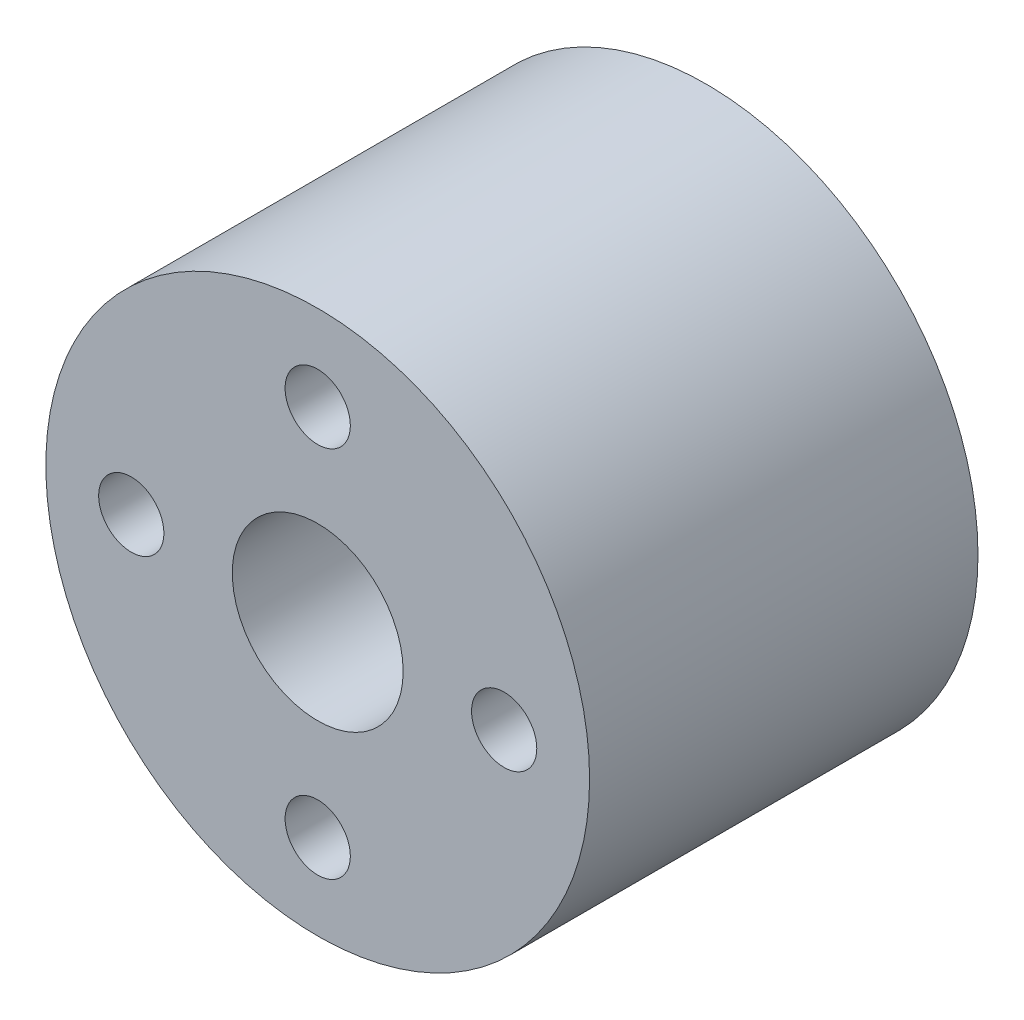
ISO-10303-21;
HEADER;
FILE_DESCRIPTION(('STEP AP214'),'2;1');
FILE_NAME('part.step','',(''),(''),'','','');
FILE_SCHEMA(('AUTOMOTIVE_DESIGN { 1 0 10303 214 1 1 1 1 }'));
ENDSEC;
DATA;
#1=APPLICATION_CONTEXT('core data for automotive mechanical design processes');
#2=APPLICATION_PROTOCOL_DEFINITION('international standard','automotive_design',2000,#1);
#3=PRODUCT_CONTEXT('',#1,'mechanical');
#4=PRODUCT('Part','Part','',(#3));
#5=PRODUCT_RELATED_PRODUCT_CATEGORY('part','',(#4));
#6=PRODUCT_DEFINITION_FORMATION('','',#4);
#7=PRODUCT_DEFINITION_CONTEXT('part definition',#1,'design');
#8=PRODUCT_DEFINITION('design','',#6,#7);
#9=PRODUCT_DEFINITION_SHAPE('','',#8);
#10=(LENGTH_UNIT() NAMED_UNIT(*) SI_UNIT(.MILLI.,.METRE.));
#11=(NAMED_UNIT(*) PLANE_ANGLE_UNIT() SI_UNIT($,.RADIAN.));
#12=(NAMED_UNIT(*) SI_UNIT($,.STERADIAN.) SOLID_ANGLE_UNIT());
#13=UNCERTAINTY_MEASURE_WITH_UNIT(LENGTH_MEASURE(1.E-05),#10,'distance_accuracy_value','');
#14=(GEOMETRIC_REPRESENTATION_CONTEXT(3) GLOBAL_UNCERTAINTY_ASSIGNED_CONTEXT((#13)) GLOBAL_UNIT_ASSIGNED_CONTEXT((#10,
#11,#12)) REPRESENTATION_CONTEXT('',''));
#15=CARTESIAN_POINT('',(0.,0.,0.));
#16=DIRECTION('',(0.,0.,1.));
#17=DIRECTION('',(1.,0.,0.));
#18=AXIS2_PLACEMENT_3D('',#15,#16,#17);
#19=CARTESIAN_POINT('',(0.,0.,-25.));
#20=DIRECTION('',(0.,0.,1.));
#21=DIRECTION('',(1.,0.,0.));
#22=AXIS2_PLACEMENT_3D('',#19,#20,#21);
#23=PLANE('',#22);
#24=CARTESIAN_POINT('',(25.0000000000002,2.45463371850718E-13,-25.));
#25=DIRECTION('',(0.,0.,1.));
#26=DIRECTION('',(1.,0.,0.));
#27=AXIS2_PLACEMENT_3D('',#24,#25,#26);
#28=CIRCLE('',#27,5.5);
#29=CARTESIAN_POINT('',(30.5000000000002,2.45463371850718E-13,-25.));
#30=VERTEX_POINT('',#29);
#31=EDGE_CURVE('E11',#30,#30,#28,.T.);
#32=ORIENTED_EDGE('',*,*,#31,.T.);
#33=EDGE_LOOP('',(#32));
#34=FACE_BOUND('',#33,.T.);
#35=CARTESIAN_POINT('',(25.0000000000002,12.,-25.));
#36=DIRECTION('',(0.,0.,1.));
#37=DIRECTION('',(1.,0.,0.));
#38=AXIS2_PLACEMENT_3D('',#35,#36,#37);
#39=CIRCLE('',#38,2.1);
#40=CARTESIAN_POINT('',(27.1000000000002,12.,-25.));
#41=VERTEX_POINT('',#40);
#42=EDGE_CURVE('E51',#41,#41,#39,.F.);
#43=ORIENTED_EDGE('',*,*,#42,.F.);
#44=EDGE_LOOP('',(#43));
#45=FACE_BOUND('',#44,.T.);
#46=CARTESIAN_POINT('',(13.0000000000005,3.71230823859037E-13,-25.));
#47=DIRECTION('',(0.,0.,1.));
#48=DIRECTION('',(1.,0.,0.));
#49=AXIS2_PLACEMENT_3D('',#46,#47,#48);
#50=CIRCLE('',#49,2.1);
#51=CARTESIAN_POINT('',(15.1000000000005,3.71230823859037E-13,-25.));
#52=VERTEX_POINT('',#51);
#53=EDGE_CURVE('E61',#52,#52,#50,.F.);
#54=ORIENTED_EDGE('',*,*,#53,.F.);
#55=EDGE_LOOP('',(#54));
#56=FACE_BOUND('',#55,.T.);
#57=CARTESIAN_POINT('',(25.0000000000002,-11.9999999999995,-25.));
#58=DIRECTION('',(0.,0.,1.));
#59=DIRECTION('',(1.,0.,0.));
#60=AXIS2_PLACEMENT_3D('',#57,#58,#59);
#61=CIRCLE('',#60,2.1);
#62=CARTESIAN_POINT('',(27.1000000000002,-11.9999999999995,-25.));
#63=VERTEX_POINT('',#62);
#64=EDGE_CURVE('E71',#63,#63,#61,.F.);
#65=ORIENTED_EDGE('',*,*,#64,.F.);
#66=EDGE_LOOP('',(#65));
#67=FACE_BOUND('',#66,.T.);
#68=CARTESIAN_POINT('',(37.,2.04697370165263E-13,-25.));
#69=DIRECTION('',(0.,0.,1.));
#70=DIRECTION('',(1.,0.,0.));
#71=AXIS2_PLACEMENT_3D('',#68,#69,#70);
#72=CIRCLE('',#71,2.1);
#73=CARTESIAN_POINT('',(39.1,2.04697370165263E-13,-25.));
#74=VERTEX_POINT('',#73);
#75=EDGE_CURVE('E60',#74,#74,#72,.F.);
#76=ORIENTED_EDGE('',*,*,#75,.F.);
#77=EDGE_LOOP('',(#76));
#78=FACE_BOUND('',#77,.T.);
#79=CARTESIAN_POINT('',(25.0000000000002,2.45463371850718E-13,-25.));
#80=DIRECTION('',(0.,0.,1.));
#81=DIRECTION('',(1.,0.,0.));
#82=AXIS2_PLACEMENT_3D('',#79,#80,#81);
#83=CIRCLE('',#82,17.5);
#84=CARTESIAN_POINT('',(42.5000000000002,2.45463371850718E-13,-25.));
#85=VERTEX_POINT('',#84);
#86=EDGE_CURVE('E70',#85,#85,#83,.T.);
#87=ORIENTED_EDGE('',*,*,#86,.F.);
#88=EDGE_LOOP('',(#87));
#89=FACE_BOUND('',#88,.T.);
#90=ADVANCED_FACE('F38',(#34,#45,#56,#67,#78,#89),#23,.F.);
#91=CARTESIAN_POINT('',(0.,0.,0.));
#92=DIRECTION('',(0.,0.,1.));
#93=DIRECTION('',(1.,0.,0.));
#94=AXIS2_PLACEMENT_3D('',#91,#92,#93);
#95=PLANE('',#94);
#96=CARTESIAN_POINT('',(25.0000000000002,2.45463371850718E-13,0.));
#97=DIRECTION('',(0.,0.,1.));
#98=DIRECTION('',(1.,0.,0.));
#99=AXIS2_PLACEMENT_3D('',#96,#97,#98);
#100=CIRCLE('',#99,5.5);
#101=CARTESIAN_POINT('',(30.5000000000002,2.45463371850718E-13,0.));
#102=VERTEX_POINT('',#101);
#103=EDGE_CURVE('E42',#102,#102,#100,.T.);
#104=ORIENTED_EDGE('',*,*,#103,.F.);
#105=EDGE_LOOP('',(#104));
#106=FACE_BOUND('',#105,.T.);
#107=CARTESIAN_POINT('',(25.0000000000002,12.,0.));
#108=DIRECTION('',(0.,0.,1.));
#109=DIRECTION('',(1.,0.,0.));
#110=AXIS2_PLACEMENT_3D('',#107,#108,#109);
#111=CIRCLE('',#110,2.1);
#112=CARTESIAN_POINT('',(27.1000000000002,12.,0.));
#113=VERTEX_POINT('',#112);
#114=EDGE_CURVE('E56',#113,#113,#111,.T.);
#115=ORIENTED_EDGE('',*,*,#114,.F.);
#116=EDGE_LOOP('',(#115));
#117=FACE_BOUND('',#116,.T.);
#118=CARTESIAN_POINT('',(13.0000000000005,3.71230823859037E-13,0.));
#119=DIRECTION('',(0.,0.,1.));
#120=DIRECTION('',(0.,1.,0.));
#121=AXIS2_PLACEMENT_3D('',#118,#119,#120);
#122=CIRCLE('',#121,2.1);
#123=CARTESIAN_POINT('',(13.0000000000005,2.10000000000037,0.));
#124=VERTEX_POINT('',#123);
#125=EDGE_CURVE('E66',#124,#124,#122,.T.);
#126=ORIENTED_EDGE('',*,*,#125,.F.);
#127=EDGE_LOOP('',(#126));
#128=FACE_BOUND('',#127,.T.);
#129=CARTESIAN_POINT('',(25.0000000000002,-11.9999999999995,0.));
#130=DIRECTION('',(0.,0.,1.));
#131=DIRECTION('',(-1.,0.,0.));
#132=AXIS2_PLACEMENT_3D('',#129,#130,#131);
#133=CIRCLE('',#132,2.1);
#134=CARTESIAN_POINT('',(22.9000000000002,-11.9999999999995,0.));
#135=VERTEX_POINT('',#134);
#136=EDGE_CURVE('E65',#135,#135,#133,.T.);
#137=ORIENTED_EDGE('',*,*,#136,.F.);
#138=EDGE_LOOP('',(#137));
#139=FACE_BOUND('',#138,.T.);
#140=CARTESIAN_POINT('',(37.,2.04697370165263E-13,0.));
#141=DIRECTION('',(0.,0.,1.));
#142=DIRECTION('',(0.,-1.,0.));
#143=AXIS2_PLACEMENT_3D('',#140,#141,#142);
#144=CIRCLE('',#143,2.1);
#145=CARTESIAN_POINT('',(37.,-2.0999999999998,0.));
#146=VERTEX_POINT('',#145);
#147=EDGE_CURVE('E75',#146,#146,#144,.T.);
#148=ORIENTED_EDGE('',*,*,#147,.F.);
#149=EDGE_LOOP('',(#148));
#150=FACE_BOUND('',#149,.T.);
#151=CARTESIAN_POINT('',(25.0000000000002,2.45463371850718E-13,0.));
#152=DIRECTION('',(0.,0.,1.));
#153=DIRECTION('',(1.,0.,0.));
#154=AXIS2_PLACEMENT_3D('',#151,#152,#153);
#155=CIRCLE('',#154,17.5);
#156=CARTESIAN_POINT('',(42.5000000000002,2.45463371850718E-13,0.));
#157=VERTEX_POINT('',#156);
#158=EDGE_CURVE('E88',#157,#157,#155,.T.);
#159=ORIENTED_EDGE('',*,*,#158,.T.);
#160=EDGE_LOOP('',(#159));
#161=FACE_BOUND('',#160,.T.);
#162=ADVANCED_FACE('F40',(#106,#117,#128,#139,#150,#161),#95,.T.);
#163=CARTESIAN_POINT('',(25.0000000000002,2.45463371850718E-13,-25.));
#164=DIRECTION('',(0.,0.,1.));
#165=DIRECTION('',(1.,0.,0.));
#166=AXIS2_PLACEMENT_3D('',#163,#164,#165);
#167=CYLINDRICAL_SURFACE('',#166,5.5);
#168=ORIENTED_EDGE('',*,*,#31,.F.);
#169=EDGE_LOOP('',(#168));
#170=FACE_BOUND('',#169,.T.);
#171=ORIENTED_EDGE('',*,*,#103,.T.);
#172=EDGE_LOOP('',(#171));
#173=FACE_BOUND('',#172,.T.);
#174=ADVANCED_FACE('F105',(#170,#173),#167,.F.);
#175=CARTESIAN_POINT('',(25.0000000000002,12.,-25.001));
#176=DIRECTION('',(0.,0.,1.));
#177=DIRECTION('',(1.,0.,0.));
#178=AXIS2_PLACEMENT_3D('',#175,#176,#177);
#179=CYLINDRICAL_SURFACE('',#178,2.1);
#180=ORIENTED_EDGE('',*,*,#114,.T.);
#181=EDGE_LOOP('',(#180));
#182=FACE_BOUND('',#181,.T.);
#183=ORIENTED_EDGE('',*,*,#42,.T.);
#184=EDGE_LOOP('',(#183));
#185=FACE_BOUND('',#184,.T.);
#186=ADVANCED_FACE('F111',(#182,#185),#179,.F.);
#187=CARTESIAN_POINT('',(13.0000000000005,3.71230823859037E-13,-25.001));
#188=DIRECTION('',(0.,0.,1.));
#189=DIRECTION('',(1.,0.,0.));
#190=AXIS2_PLACEMENT_3D('',#187,#188,#189);
#191=CYLINDRICAL_SURFACE('',#190,2.1);
#192=ORIENTED_EDGE('',*,*,#125,.T.);
#193=EDGE_LOOP('',(#192));
#194=FACE_BOUND('',#193,.T.);
#195=ORIENTED_EDGE('',*,*,#53,.T.);
#196=EDGE_LOOP('',(#195));
#197=FACE_BOUND('',#196,.T.);
#198=ADVANCED_FACE('F115',(#194,#197),#191,.F.);
#199=CARTESIAN_POINT('',(25.0000000000002,-11.9999999999995,-25.001));
#200=DIRECTION('',(0.,0.,1.));
#201=DIRECTION('',(1.,0.,0.));
#202=AXIS2_PLACEMENT_3D('',#199,#200,#201);
#203=CYLINDRICAL_SURFACE('',#202,2.1);
#204=ORIENTED_EDGE('',*,*,#136,.T.);
#205=EDGE_LOOP('',(#204));
#206=FACE_BOUND('',#205,.T.);
#207=ORIENTED_EDGE('',*,*,#64,.T.);
#208=EDGE_LOOP('',(#207));
#209=FACE_BOUND('',#208,.T.);
#210=ADVANCED_FACE('F119',(#206,#209),#203,.F.);
#211=CARTESIAN_POINT('',(37.,2.04697370165263E-13,-25.001));
#212=DIRECTION('',(0.,0.,1.));
#213=DIRECTION('',(1.,0.,0.));
#214=AXIS2_PLACEMENT_3D('',#211,#212,#213);
#215=CYLINDRICAL_SURFACE('',#214,2.1);
#216=ORIENTED_EDGE('',*,*,#147,.T.);
#217=EDGE_LOOP('',(#216));
#218=FACE_BOUND('',#217,.T.);
#219=ORIENTED_EDGE('',*,*,#75,.T.);
#220=EDGE_LOOP('',(#219));
#221=FACE_BOUND('',#220,.T.);
#222=ADVANCED_FACE('F97',(#218,#221),#215,.F.);
#223=CARTESIAN_POINT('',(25.0000000000002,2.45463371850718E-13,-300.));
#224=DIRECTION('',(0.,0.,1.));
#225=DIRECTION('',(1.,0.,0.));
#226=AXIS2_PLACEMENT_3D('',#223,#224,#225);
#227=CYLINDRICAL_SURFACE('',#226,17.5);
#228=ORIENTED_EDGE('',*,*,#158,.F.);
#229=EDGE_LOOP('',(#228));
#230=FACE_BOUND('',#229,.T.);
#231=ORIENTED_EDGE('',*,*,#86,.T.);
#232=EDGE_LOOP('',(#231));
#233=FACE_BOUND('',#232,.T.);
#234=ADVANCED_FACE('F94',(#230,#233),#227,.T.);
#235=CLOSED_SHELL('',(#90,#162,#174,#186,#198,#210,#222,#234));
#236=MANIFOLD_SOLID_BREP('B2',#235);
#237=ADVANCED_BREP_SHAPE_REPRESENTATION('',(#18,#236),#14);
#238=SHAPE_DEFINITION_REPRESENTATION(#9,#237);
ENDSEC;
END-ISO-10303-21;
